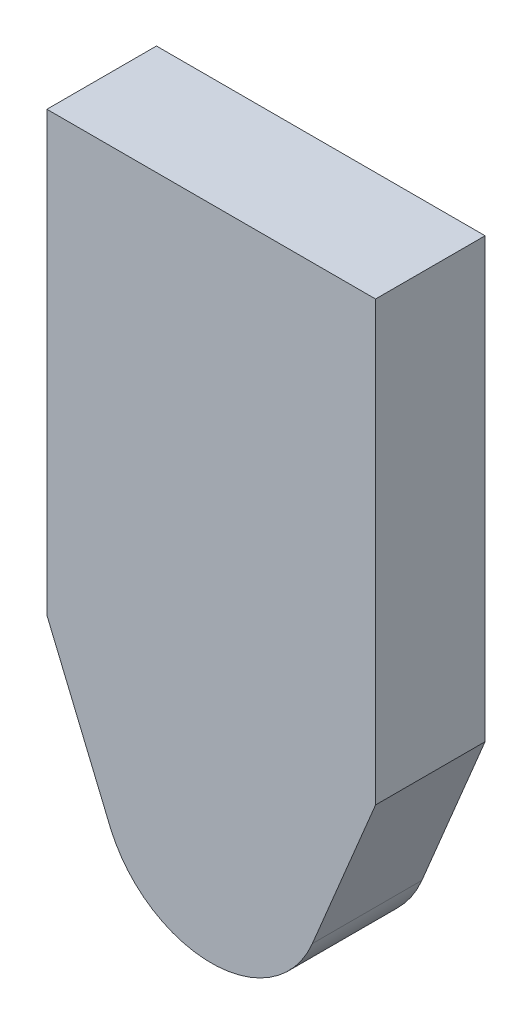
ISO-10303-21;
HEADER;
FILE_DESCRIPTION(('STEP AP214'),'2;1');
FILE_NAME('part.step','',(''),(''),'','','');
FILE_SCHEMA(('AUTOMOTIVE_DESIGN { 1 0 10303 214 1 1 1 1 }'));
ENDSEC;
DATA;
#1=APPLICATION_CONTEXT('core data for automotive mechanical design processes');
#2=APPLICATION_PROTOCOL_DEFINITION('international standard','automotive_design',2000,#1);
#3=PRODUCT_CONTEXT('',#1,'mechanical');
#4=PRODUCT('Part','Part','',(#3));
#5=PRODUCT_RELATED_PRODUCT_CATEGORY('part','',(#4));
#6=PRODUCT_DEFINITION_FORMATION('','',#4);
#7=PRODUCT_DEFINITION_CONTEXT('part definition',#1,'design');
#8=PRODUCT_DEFINITION('design','',#6,#7);
#9=PRODUCT_DEFINITION_SHAPE('','',#8);
#10=(LENGTH_UNIT() NAMED_UNIT(*) SI_UNIT(.MILLI.,.METRE.));
#11=(NAMED_UNIT(*) PLANE_ANGLE_UNIT() SI_UNIT($,.RADIAN.));
#12=(NAMED_UNIT(*) SI_UNIT($,.STERADIAN.) SOLID_ANGLE_UNIT());
#13=UNCERTAINTY_MEASURE_WITH_UNIT(LENGTH_MEASURE(1.E-05),#10,'distance_accuracy_value','');
#14=(GEOMETRIC_REPRESENTATION_CONTEXT(3) GLOBAL_UNCERTAINTY_ASSIGNED_CONTEXT((#13)) GLOBAL_UNIT_ASSIGNED_CONTEXT((#10,
#11,#12)) REPRESENTATION_CONTEXT('',''));
#15=CARTESIAN_POINT('',(0.,0.,0.));
#16=DIRECTION('',(0.,0.,1.));
#17=DIRECTION('',(1.,0.,0.));
#18=AXIS2_PLACEMENT_3D('',#15,#16,#17);
#19=CARTESIAN_POINT('',(5.86153846153847,-8.79230769230769,6.35));
#20=DIRECTION('',(-0.923076923076923,0.384615384615384,0.));
#21=DIRECTION('',(-0.384615384615384,-0.923076923076923,0.));
#22=AXIS2_PLACEMENT_3D('',#19,#20,#21);
#23=PLANE('',#22);
#24=DIRECTION('',(0.384615384615384,0.923076923076923,0.));
#25=VECTOR('',#24,1.);
#26=CARTESIAN_POINT('',(5.86153846153847,-8.79230769230769,0.));
#27=LINE('',#26,#25);
#28=CARTESIAN_POINT('',(5.86153846153847,-8.79230769230769,0.));
#29=VERTEX_POINT('',#28);
#30=CARTESIAN_POINT('',(9.525,0.,0.));
#31=VERTEX_POINT('',#30);
#32=EDGE_CURVE('E99',#29,#31,#27,.T.);
#33=ORIENTED_EDGE('',*,*,#32,.T.);
#34=DIRECTION('',(0.,0.,-1.));
#35=VECTOR('',#34,1.);
#36=CARTESIAN_POINT('',(9.525,0.,6.35));
#37=LINE('',#36,#35);
#38=CARTESIAN_POINT('',(9.525,0.,6.35));
#39=VERTEX_POINT('',#38);
#40=EDGE_CURVE('E11',#39,#31,#37,.T.);
#41=ORIENTED_EDGE('',*,*,#40,.F.);
#42=DIRECTION('',(0.384615384615384,0.923076923076923,0.));
#43=VECTOR('',#42,1.);
#44=CARTESIAN_POINT('',(5.86153846153847,-8.79230769230769,6.35));
#45=LINE('',#44,#43);
#46=CARTESIAN_POINT('',(5.86153846153847,-8.79230769230769,6.35));
#47=VERTEX_POINT('',#46);
#48=EDGE_CURVE('E80',#47,#39,#45,.T.);
#49=ORIENTED_EDGE('',*,*,#48,.F.);
#50=DIRECTION('',(0.,0.,-1.));
#51=VECTOR('',#50,1.);
#52=CARTESIAN_POINT('',(5.86153846153847,-8.79230769230769,6.35));
#53=LINE('',#52,#51);
#54=EDGE_CURVE('E101',#47,#29,#53,.T.);
#55=ORIENTED_EDGE('',*,*,#54,.T.);
#56=EDGE_LOOP('',(#33,#41,#49,#55));
#57=FACE_BOUND('',#56,.T.);
#58=ADVANCED_FACE('F39',(#57),#23,.F.);
#59=CARTESIAN_POINT('',(-9.525,0.,6.35));
#60=DIRECTION('',(0.923076923076923,0.384615384615384,0.));
#61=DIRECTION('',(-0.384615384615384,0.923076923076923,0.));
#62=AXIS2_PLACEMENT_3D('',#59,#60,#61);
#63=PLANE('',#62);
#64=DIRECTION('',(0.384615384615384,-0.923076923076923,0.));
#65=VECTOR('',#64,1.);
#66=CARTESIAN_POINT('',(-9.525,0.,0.));
#67=LINE('',#66,#65);
#68=CARTESIAN_POINT('',(-9.525,0.,0.));
#69=VERTEX_POINT('',#68);
#70=CARTESIAN_POINT('',(-5.86153846153846,-8.79230769230769,0.));
#71=VERTEX_POINT('',#70);
#72=EDGE_CURVE('E69',#69,#71,#67,.T.);
#73=ORIENTED_EDGE('',*,*,#72,.T.);
#74=DIRECTION('',(0.,0.,-1.));
#75=VECTOR('',#74,1.);
#76=CARTESIAN_POINT('',(-5.86153846153846,-8.79230769230769,6.35));
#77=LINE('',#76,#75);
#78=CARTESIAN_POINT('',(-5.86153846153846,-8.79230769230769,6.35));
#79=VERTEX_POINT('',#78);
#80=EDGE_CURVE('E139',#79,#71,#77,.T.);
#81=ORIENTED_EDGE('',*,*,#80,.F.);
#82=DIRECTION('',(0.384615384615384,-0.923076923076923,0.));
#83=VECTOR('',#82,1.);
#84=CARTESIAN_POINT('',(-9.525,0.,6.35));
#85=LINE('',#84,#83);
#86=CARTESIAN_POINT('',(-9.525,0.,6.35));
#87=VERTEX_POINT('',#86);
#88=EDGE_CURVE('E133',#87,#79,#85,.T.);
#89=ORIENTED_EDGE('',*,*,#88,.F.);
#90=DIRECTION('',(0.,0.,-1.));
#91=VECTOR('',#90,1.);
#92=CARTESIAN_POINT('',(-9.525,0.,6.35));
#93=LINE('',#92,#91);
#94=EDGE_CURVE('E47',#87,#69,#93,.T.);
#95=ORIENTED_EDGE('',*,*,#94,.T.);
#96=EDGE_LOOP('',(#73,#81,#89,#95));
#97=FACE_BOUND('',#96,.T.);
#98=ADVANCED_FACE('F141',(#97),#63,.F.);
#99=CARTESIAN_POINT('',(0.,-6.35,6.35));
#100=DIRECTION('',(0.,0.,-1.));
#101=DIRECTION('',(-1.,0.,0.));
#102=AXIS2_PLACEMENT_3D('',#99,#100,#101);
#103=CYLINDRICAL_SURFACE('',#102,6.35);
#104=CARTESIAN_POINT('',(0.,-6.35,0.));
#105=DIRECTION('',(0.,0.,1.));
#106=DIRECTION('',(1.,0.,0.));
#107=AXIS2_PLACEMENT_3D('',#104,#105,#106);
#108=CIRCLE('',#107,6.35);
#109=EDGE_CURVE('E75',#71,#29,#108,.T.);
#110=ORIENTED_EDGE('',*,*,#109,.T.);
#111=ORIENTED_EDGE('',*,*,#54,.F.);
#112=CARTESIAN_POINT('',(0.,-6.35,6.35));
#113=DIRECTION('',(0.,0.,1.));
#114=DIRECTION('',(1.,0.,0.));
#115=AXIS2_PLACEMENT_3D('',#112,#113,#114);
#116=CIRCLE('',#115,6.35);
#117=EDGE_CURVE('E55',#79,#47,#116,.T.);
#118=ORIENTED_EDGE('',*,*,#117,.F.);
#119=ORIENTED_EDGE('',*,*,#80,.T.);
#120=EDGE_LOOP('',(#110,#111,#118,#119));
#121=FACE_BOUND('',#120,.T.);
#122=ADVANCED_FACE('F149',(#121),#103,.T.);
#123=CARTESIAN_POINT('',(0.,-6.35,6.35));
#124=DIRECTION('',(0.,0.,1.));
#125=DIRECTION('',(1.,0.,0.));
#126=AXIS2_PLACEMENT_3D('',#123,#124,#125);
#127=PLANE('',#126);
#128=ORIENTED_EDGE('',*,*,#48,.T.);
#129=DIRECTION('',(0.,1.,0.));
#130=VECTOR('',#129,1.);
#131=CARTESIAN_POINT('',(9.525,0.,6.35));
#132=LINE('',#131,#130);
#133=CARTESIAN_POINT('',(9.525,25.4,6.35));
#134=VERTEX_POINT('',#133);
#135=EDGE_CURVE('E111',#39,#134,#132,.T.);
#136=ORIENTED_EDGE('',*,*,#135,.T.);
#137=DIRECTION('',(-1.,0.,0.));
#138=VECTOR('',#137,1.);
#139=CARTESIAN_POINT('',(-9.525,25.4,6.35));
#140=LINE('',#139,#138);
#141=CARTESIAN_POINT('',(-9.525,25.4,6.35));
#142=VERTEX_POINT('',#141);
#143=EDGE_CURVE('E121',#134,#142,#140,.T.);
#144=ORIENTED_EDGE('',*,*,#143,.T.);
#145=DIRECTION('',(0.,-1.,0.));
#146=VECTOR('',#145,1.);
#147=CARTESIAN_POINT('',(-9.525,0.,6.35));
#148=LINE('',#147,#146);
#149=EDGE_CURVE('E124',#142,#87,#148,.T.);
#150=ORIENTED_EDGE('',*,*,#149,.T.);
#151=ORIENTED_EDGE('',*,*,#88,.T.);
#152=ORIENTED_EDGE('',*,*,#117,.T.);
#153=EDGE_LOOP('',(#128,#136,#144,#150,#151,#152));
#154=FACE_BOUND('',#153,.T.);
#155=ADVANCED_FACE('F148',(#154),#127,.T.);
#156=CARTESIAN_POINT('',(0.,-6.35,0.));
#157=DIRECTION('',(0.,0.,1.));
#158=DIRECTION('',(1.,0.,0.));
#159=AXIS2_PLACEMENT_3D('',#156,#157,#158);
#160=PLANE('',#159);
#161=ORIENTED_EDGE('',*,*,#32,.F.);
#162=ORIENTED_EDGE('',*,*,#109,.F.);
#163=ORIENTED_EDGE('',*,*,#72,.F.);
#164=DIRECTION('',(0.,-1.,0.));
#165=VECTOR('',#164,1.);
#166=CARTESIAN_POINT('',(-9.525,0.,0.));
#167=LINE('',#166,#165);
#168=CARTESIAN_POINT('',(-9.525,25.4,0.));
#169=VERTEX_POINT('',#168);
#170=EDGE_CURVE('E116',#169,#69,#167,.T.);
#171=ORIENTED_EDGE('',*,*,#170,.F.);
#172=DIRECTION('',(-1.,0.,0.));
#173=VECTOR('',#172,1.);
#174=CARTESIAN_POINT('',(-9.525,25.4,0.));
#175=LINE('',#174,#173);
#176=CARTESIAN_POINT('',(9.525,25.4,0.));
#177=VERTEX_POINT('',#176);
#178=EDGE_CURVE('E115',#177,#169,#175,.T.);
#179=ORIENTED_EDGE('',*,*,#178,.F.);
#180=DIRECTION('',(0.,1.,0.));
#181=VECTOR('',#180,1.);
#182=CARTESIAN_POINT('',(9.525,0.,0.));
#183=LINE('',#182,#181);
#184=EDGE_CURVE('E109',#31,#177,#183,.T.);
#185=ORIENTED_EDGE('',*,*,#184,.F.);
#186=EDGE_LOOP('',(#161,#162,#163,#171,#179,#185));
#187=FACE_BOUND('',#186,.T.);
#188=ADVANCED_FACE('F112',(#187),#160,.F.);
#189=CARTESIAN_POINT('',(-9.525,0.,0.));
#190=DIRECTION('',(-1.,0.,0.));
#191=DIRECTION('',(0.,0.,1.));
#192=AXIS2_PLACEMENT_3D('',#189,#190,#191);
#193=PLANE('',#192);
#194=ORIENTED_EDGE('',*,*,#149,.F.);
#195=DIRECTION('',(0.,0.,1.));
#196=VECTOR('',#195,1.);
#197=CARTESIAN_POINT('',(-9.525,25.4,0.));
#198=LINE('',#197,#196);
#199=EDGE_CURVE('E104',#169,#142,#198,.T.);
#200=ORIENTED_EDGE('',*,*,#199,.F.);
#201=ORIENTED_EDGE('',*,*,#170,.T.);
#202=ORIENTED_EDGE('',*,*,#94,.F.);
#203=EDGE_LOOP('',(#194,#200,#201,#202));
#204=FACE_BOUND('',#203,.T.);
#205=ADVANCED_FACE('F144',(#204),#193,.T.);
#206=CARTESIAN_POINT('',(-9.525,25.4,0.));
#207=DIRECTION('',(0.,1.,0.));
#208=DIRECTION('',(0.,0.,1.));
#209=AXIS2_PLACEMENT_3D('',#206,#207,#208);
#210=PLANE('',#209);
#211=ORIENTED_EDGE('',*,*,#143,.F.);
#212=DIRECTION('',(0.,0.,1.));
#213=VECTOR('',#212,1.);
#214=CARTESIAN_POINT('',(9.525,25.4,0.));
#215=LINE('',#214,#213);
#216=EDGE_CURVE('E118',#177,#134,#215,.T.);
#217=ORIENTED_EDGE('',*,*,#216,.F.);
#218=ORIENTED_EDGE('',*,*,#178,.T.);
#219=ORIENTED_EDGE('',*,*,#199,.T.);
#220=EDGE_LOOP('',(#211,#217,#218,#219));
#221=FACE_BOUND('',#220,.T.);
#222=ADVANCED_FACE('F147',(#221),#210,.T.);
#223=CARTESIAN_POINT('',(9.525,0.,0.));
#224=DIRECTION('',(1.,0.,0.));
#225=DIRECTION('',(0.,0.,-1.));
#226=AXIS2_PLACEMENT_3D('',#223,#224,#225);
#227=PLANE('',#226);
#228=ORIENTED_EDGE('',*,*,#135,.F.);
#229=ORIENTED_EDGE('',*,*,#40,.T.);
#230=ORIENTED_EDGE('',*,*,#184,.T.);
#231=ORIENTED_EDGE('',*,*,#216,.T.);
#232=EDGE_LOOP('',(#228,#229,#230,#231));
#233=FACE_BOUND('',#232,.T.);
#234=ADVANCED_FACE('F108',(#233),#227,.T.);
#235=CLOSED_SHELL('',(#58,#98,#122,#155,#188,#205,#222,#234));
#236=MANIFOLD_SOLID_BREP('B2',#235);
#237=ADVANCED_BREP_SHAPE_REPRESENTATION('',(#18,#236),#14);
#238=SHAPE_DEFINITION_REPRESENTATION(#9,#237);
ENDSEC;
END-ISO-10303-21;
